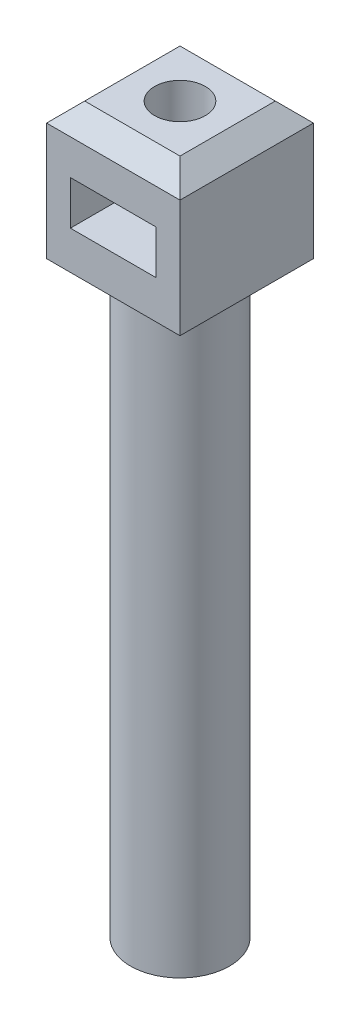
ISO-10303-21;
HEADER;
FILE_DESCRIPTION(('STEP AP214'),'2;1');
FILE_NAME('part.step','',(''),(''),'','','');
FILE_SCHEMA(('AUTOMOTIVE_DESIGN { 1 0 10303 214 1 1 1 1 }'));
ENDSEC;
DATA;
#1=APPLICATION_CONTEXT('core data for automotive mechanical design processes');
#2=APPLICATION_PROTOCOL_DEFINITION('international standard','automotive_design',2000,#1);
#3=PRODUCT_CONTEXT('',#1,'mechanical');
#4=PRODUCT('Part','Part','',(#3));
#5=PRODUCT_RELATED_PRODUCT_CATEGORY('part','',(#4));
#6=PRODUCT_DEFINITION_FORMATION('','',#4);
#7=PRODUCT_DEFINITION_CONTEXT('part definition',#1,'design');
#8=PRODUCT_DEFINITION('design','',#6,#7);
#9=PRODUCT_DEFINITION_SHAPE('','',#8);
#10=(LENGTH_UNIT() NAMED_UNIT(*) SI_UNIT(.MILLI.,.METRE.));
#11=(NAMED_UNIT(*) PLANE_ANGLE_UNIT() SI_UNIT($,.RADIAN.));
#12=(NAMED_UNIT(*) SI_UNIT($,.STERADIAN.) SOLID_ANGLE_UNIT());
#13=UNCERTAINTY_MEASURE_WITH_UNIT(LENGTH_MEASURE(1.E-05),#10,'distance_accuracy_value','');
#14=(GEOMETRIC_REPRESENTATION_CONTEXT(3) GLOBAL_UNCERTAINTY_ASSIGNED_CONTEXT((#13)) GLOBAL_UNIT_ASSIGNED_CONTEXT((#10,
#11,#12)) REPRESENTATION_CONTEXT('',''));
#15=CARTESIAN_POINT('',(0.,0.,0.));
#16=DIRECTION('',(0.,0.,1.));
#17=DIRECTION('',(1.,0.,0.));
#18=AXIS2_PLACEMENT_3D('',#15,#16,#17);
#19=CARTESIAN_POINT('',(0.,50.8,0.));
#20=DIRECTION('',(0.,-1.,0.));
#21=DIRECTION('',(0.,0.,-1.));
#22=AXIS2_PLACEMENT_3D('',#19,#20,#21);
#23=PLANE('',#22);
#24=DIRECTION('',(0.,0.,-1.));
#25=VECTOR('',#24,1.);
#26=CARTESIAN_POINT('',(-6.34999999999998,50.8,-8.89));
#27=LINE('',#26,#25);
#28=CARTESIAN_POINT('',(-6.34999999999998,50.8,-1.81392282084995));
#29=VERTEX_POINT('',#28);
#30=CARTESIAN_POINT('',(-6.34999999999998,50.8,-6.34999999999998));
#31=VERTEX_POINT('',#30);
#32=EDGE_CURVE('E194',#29,#31,#27,.T.);
#33=ORIENTED_EDGE('',*,*,#32,.T.);
#34=DIRECTION('',(1.,0.,0.));
#35=VECTOR('',#34,1.);
#36=CARTESIAN_POINT('',(8.89,50.8,-6.34999999999998));
#37=LINE('',#36,#35);
#38=CARTESIAN_POINT('',(-1.81392282084994,50.8,-6.34999999999998));
#39=VERTEX_POINT('',#38);
#40=EDGE_CURVE('E196',#31,#39,#37,.T.);
#41=ORIENTED_EDGE('',*,*,#40,.T.);
#42=CARTESIAN_POINT('',(0.,50.8,0.));
#43=DIRECTION('',(0.,-1.,0.));
#44=DIRECTION('',(0.,0.,-1.));
#45=AXIS2_PLACEMENT_3D('',#42,#43,#44);
#46=CIRCLE('',#45,6.604);
#47=EDGE_CURVE('E287',#29,#39,#46,.T.);
#48=ORIENTED_EDGE('',*,*,#47,.F.);
#49=EDGE_LOOP('',(#33,#41,#48));
#50=FACE_BOUND('',#49,.T.);
#51=ADVANCED_FACE('F35',(#50),#23,.T.);
#52=CARTESIAN_POINT('',(1.81392282084994,50.8,-6.34999999999998));
#53=VERTEX_POINT('',#52);
#54=CARTESIAN_POINT('',(6.34999999999999,50.8,-1.81392282084993));
#55=VERTEX_POINT('',#54);
#56=EDGE_CURVE('E159',#53,#55,#46,.T.);
#57=ORIENTED_EDGE('',*,*,#56,.F.);
#58=DIRECTION('',(1.,0.,0.));
#59=VECTOR('',#58,1.);
#60=CARTESIAN_POINT('',(8.89,50.8,-6.34999999999998));
#61=LINE('',#60,#59);
#62=CARTESIAN_POINT('',(6.34999999999999,50.8,-6.34999999999998));
#63=VERTEX_POINT('',#62);
#64=EDGE_CURVE('E192',#53,#63,#61,.T.);
#65=ORIENTED_EDGE('',*,*,#64,.T.);
#66=DIRECTION('',(0.,0.,1.));
#67=VECTOR('',#66,1.);
#68=CARTESIAN_POINT('',(6.34999999999999,50.8,8.89));
#69=LINE('',#68,#67);
#70=EDGE_CURVE('E190',#63,#55,#69,.T.);
#71=ORIENTED_EDGE('',*,*,#70,.T.);
#72=EDGE_LOOP('',(#57,#65,#71));
#73=FACE_BOUND('',#72,.T.);
#74=ADVANCED_FACE('F318',(#73),#23,.T.);
#75=CARTESIAN_POINT('',(6.34999999999999,50.8,1.81392282084993));
#76=VERTEX_POINT('',#75);
#77=CARTESIAN_POINT('',(1.81392282084994,50.8,6.34999999999998));
#78=VERTEX_POINT('',#77);
#79=EDGE_CURVE('E289',#76,#78,#46,.T.);
#80=ORIENTED_EDGE('',*,*,#79,.F.);
#81=DIRECTION('',(0.,0.,1.));
#82=VECTOR('',#81,1.);
#83=CARTESIAN_POINT('',(6.34999999999999,50.8,8.89));
#84=LINE('',#83,#82);
#85=CARTESIAN_POINT('',(6.34999999999999,50.8,6.34999999999998));
#86=VERTEX_POINT('',#85);
#87=EDGE_CURVE('E188',#76,#86,#84,.T.);
#88=ORIENTED_EDGE('',*,*,#87,.T.);
#89=DIRECTION('',(-1.,0.,0.));
#90=VECTOR('',#89,1.);
#91=CARTESIAN_POINT('',(-8.89,50.8,6.34999999999998));
#92=LINE('',#91,#90);
#93=EDGE_CURVE('E186',#86,#78,#92,.T.);
#94=ORIENTED_EDGE('',*,*,#93,.T.);
#95=EDGE_LOOP('',(#80,#88,#94));
#96=FACE_BOUND('',#95,.T.);
#97=ADVANCED_FACE('F339',(#96),#23,.T.);
#98=CARTESIAN_POINT('',(0.,63.5,0.));
#99=DIRECTION('',(0.,-1.,0.));
#100=DIRECTION('',(0.,0.,-1.));
#101=AXIS2_PLACEMENT_3D('',#98,#99,#100);
#102=CYLINDRICAL_SURFACE('',#101,6.604);
#103=ORIENTED_EDGE('',*,*,#56,.T.);
#104=CARTESIAN_POINT('',(0.,45.4717173420242,0.));
#105=DIRECTION('',(0.642787609686544,-0.766044443118974,0.));
#106=DIRECTION('',(-0.766044443118974,-0.642787609686544,0.));
#107=AXIS2_PLACEMENT_3D('',#104,#105,#106);
#108=ELLIPSE('',#107,8.62090973875041,6.604);
#109=EDGE_CURVE('E212',#55,#76,#108,.T.);
#110=ORIENTED_EDGE('',*,*,#109,.T.);
#111=ORIENTED_EDGE('',*,*,#79,.T.);
#112=CARTESIAN_POINT('',(0.,45.4717173420242,0.));
#113=DIRECTION('',(0.,-0.766044443118974,0.642787609686544));
#114=DIRECTION('',(0.,-0.642787609686544,-0.766044443118974));
#115=AXIS2_PLACEMENT_3D('',#112,#113,#114);
#116=ELLIPSE('',#115,8.62090973875041,6.604);
#117=CARTESIAN_POINT('',(-1.81392282084994,50.8,6.34999999999998));
#118=VERTEX_POINT('',#117);
#119=EDGE_CURVE('E214',#78,#118,#116,.T.);
#120=ORIENTED_EDGE('',*,*,#119,.T.);
#121=CARTESIAN_POINT('',(-6.34999999999998,50.8,1.81392282084995));
#122=VERTEX_POINT('',#121);
#123=EDGE_CURVE('E294',#118,#122,#46,.T.);
#124=ORIENTED_EDGE('',*,*,#123,.T.);
#125=CARTESIAN_POINT('',(0.,45.4717173420242,0.));
#126=DIRECTION('',(-0.642787609686544,-0.766044443118974,0.));
#127=DIRECTION('',(0.766044443118974,-0.642787609686544,0.));
#128=AXIS2_PLACEMENT_3D('',#125,#126,#127);
#129=ELLIPSE('',#128,8.62090973875041,6.604);
#130=EDGE_CURVE('E210',#122,#29,#129,.T.);
#131=ORIENTED_EDGE('',*,*,#130,.T.);
#132=ORIENTED_EDGE('',*,*,#47,.T.);
#133=CARTESIAN_POINT('',(0.,45.4717173420242,0.));
#134=DIRECTION('',(0.,-0.766044443118974,-0.642787609686544));
#135=DIRECTION('',(0.,-0.642787609686544,0.766044443118974));
#136=AXIS2_PLACEMENT_3D('',#133,#134,#135);
#137=ELLIPSE('',#136,8.62090973875041,6.604);
#138=EDGE_CURVE('E208',#39,#53,#137,.T.);
#139=ORIENTED_EDGE('',*,*,#138,.T.);
#140=EDGE_LOOP('',(#103,#110,#111,#120,#124,#131,#132,#139));
#141=FACE_BOUND('',#140,.T.);
#142=CARTESIAN_POINT('',(0.,-25.4,0.));
#143=DIRECTION('',(0.,-1.,0.));
#144=DIRECTION('',(0.,0.,-1.));
#145=AXIS2_PLACEMENT_3D('',#142,#143,#144);
#146=CIRCLE('',#145,6.604);
#147=CARTESIAN_POINT('',(0.,-25.4,-6.604));
#148=VERTEX_POINT('',#147);
#149=EDGE_CURVE('E249',#148,#148,#146,.T.);
#150=ORIENTED_EDGE('',*,*,#149,.F.);
#151=EDGE_LOOP('',(#150));
#152=FACE_BOUND('',#151,.T.);
#153=ADVANCED_FACE('F300',(#141,#152),#102,.T.);
#154=DIRECTION('',(-1.,0.,0.));
#155=VECTOR('',#154,1.);
#156=CARTESIAN_POINT('',(-8.89,50.8,6.34999999999998));
#157=LINE('',#156,#155);
#158=CARTESIAN_POINT('',(-6.34999999999998,50.8,6.34999999999998));
#159=VERTEX_POINT('',#158);
#160=EDGE_CURVE('E182',#118,#159,#157,.T.);
#161=ORIENTED_EDGE('',*,*,#160,.T.);
#162=DIRECTION('',(0.,0.,-1.));
#163=VECTOR('',#162,1.);
#164=CARTESIAN_POINT('',(-6.34999999999998,50.8,-8.89));
#165=LINE('',#164,#163);
#166=EDGE_CURVE('E184',#159,#122,#165,.T.);
#167=ORIENTED_EDGE('',*,*,#166,.T.);
#168=ORIENTED_EDGE('',*,*,#123,.F.);
#169=EDGE_LOOP('',(#161,#167,#168));
#170=FACE_BOUND('',#169,.T.);
#171=ADVANCED_FACE('F342',(#170),#23,.T.);
#172=CARTESIAN_POINT('',(8.89,71.12,8.89));
#173=DIRECTION('',(-1.,0.,0.));
#174=DIRECTION('',(0.,0.,1.));
#175=AXIS2_PLACEMENT_3D('',#172,#173,#174);
#176=PLANE('',#175);
#177=DIRECTION('',(0.,-1.,0.));
#178=VECTOR('',#177,1.);
#179=CARTESIAN_POINT('',(8.89,71.12,-8.89));
#180=LINE('',#179,#178);
#181=CARTESIAN_POINT('',(8.89,68.58,-8.89));
#182=VERTEX_POINT('',#181);
#183=CARTESIAN_POINT('',(8.89,52.9313130631903,-8.89));
#184=VERTEX_POINT('',#183);
#185=EDGE_CURVE('E286',#182,#184,#180,.T.);
#186=ORIENTED_EDGE('',*,*,#185,.F.);
#187=DIRECTION('',(0.,0.,1.));
#188=VECTOR('',#187,1.);
#189=CARTESIAN_POINT('',(8.89,68.58,8.89));
#190=LINE('',#189,#188);
#191=CARTESIAN_POINT('',(8.89,68.58,8.89));
#192=VERTEX_POINT('',#191);
#193=EDGE_CURVE('E232',#182,#192,#190,.T.);
#194=ORIENTED_EDGE('',*,*,#193,.T.);
#195=DIRECTION('',(0.,-1.,0.));
#196=VECTOR('',#195,1.);
#197=CARTESIAN_POINT('',(8.89,71.12,8.89));
#198=LINE('',#197,#196);
#199=CARTESIAN_POINT('',(8.89,52.9313130631903,8.89));
#200=VERTEX_POINT('',#199);
#201=EDGE_CURVE('E280',#192,#200,#198,.T.);
#202=ORIENTED_EDGE('',*,*,#201,.T.);
#203=DIRECTION('',(0.,0.,-1.));
#204=VECTOR('',#203,1.);
#205=CARTESIAN_POINT('',(8.89,52.9313130631903,-8.89));
#206=LINE('',#205,#204);
#207=EDGE_CURVE('E202',#200,#184,#206,.T.);
#208=ORIENTED_EDGE('',*,*,#207,.T.);
#209=EDGE_LOOP('',(#186,#194,#202,#208));
#210=FACE_BOUND('',#209,.T.);
#211=ADVANCED_FACE('F330',(#210),#176,.F.);
#212=CARTESIAN_POINT('',(-8.89,71.12,-8.89));
#213=DIRECTION('',(0.,0.,1.));
#214=DIRECTION('',(1.,0.,0.));
#215=AXIS2_PLACEMENT_3D('',#212,#213,#214);
#216=PLANE('',#215);
#217=DIRECTION('',(1.,0.,0.));
#218=VECTOR('',#217,1.);
#219=CARTESIAN_POINT('',(-8.89,58.039,-8.89));
#220=LINE('',#219,#218);
#221=CARTESIAN_POINT('',(-5.71500000000003,58.039,-8.89));
#222=VERTEX_POINT('',#221);
#223=CARTESIAN_POINT('',(5.71499999999997,58.039,-8.89));
#224=VERTEX_POINT('',#223);
#225=EDGE_CURVE('E274',#222,#224,#220,.T.);
#226=ORIENTED_EDGE('',*,*,#225,.T.);
#227=DIRECTION('',(0.,1.,0.));
#228=VECTOR('',#227,1.);
#229=CARTESIAN_POINT('',(5.71499999999997,71.12,-8.89));
#230=LINE('',#229,#228);
#231=CARTESIAN_POINT('',(5.71499999999997,63.881,-8.89));
#232=VERTEX_POINT('',#231);
#233=EDGE_CURVE('E277',#224,#232,#230,.T.);
#234=ORIENTED_EDGE('',*,*,#233,.T.);
#235=DIRECTION('',(-1.,0.,0.));
#236=VECTOR('',#235,1.);
#237=CARTESIAN_POINT('',(-8.89,63.881,-8.89));
#238=LINE('',#237,#236);
#239=CARTESIAN_POINT('',(-5.71500000000003,63.881,-8.89));
#240=VERTEX_POINT('',#239);
#241=EDGE_CURVE('E269',#232,#240,#238,.T.);
#242=ORIENTED_EDGE('',*,*,#241,.T.);
#243=DIRECTION('',(0.,-1.,0.));
#244=VECTOR('',#243,1.);
#245=CARTESIAN_POINT('',(-5.71500000000003,71.12,-8.89));
#246=LINE('',#245,#244);
#247=EDGE_CURVE('E166',#240,#222,#246,.T.);
#248=ORIENTED_EDGE('',*,*,#247,.T.);
#249=EDGE_LOOP('',(#226,#234,#242,#248));
#250=FACE_BOUND('',#249,.T.);
#251=DIRECTION('',(0.,-1.,0.));
#252=VECTOR('',#251,1.);
#253=CARTESIAN_POINT('',(-8.89,71.12,-8.89));
#254=LINE('',#253,#252);
#255=CARTESIAN_POINT('',(-8.89,68.58,-8.89));
#256=VERTEX_POINT('',#255);
#257=CARTESIAN_POINT('',(-8.89,52.9313130631903,-8.89));
#258=VERTEX_POINT('',#257);
#259=EDGE_CURVE('E284',#256,#258,#254,.T.);
#260=ORIENTED_EDGE('',*,*,#259,.F.);
#261=DIRECTION('',(1.,0.,0.));
#262=VECTOR('',#261,1.);
#263=CARTESIAN_POINT('',(-8.89,68.58,-8.89));
#264=LINE('',#263,#262);
#265=EDGE_CURVE('E242',#256,#182,#264,.T.);
#266=ORIENTED_EDGE('',*,*,#265,.T.);
#267=ORIENTED_EDGE('',*,*,#185,.T.);
#268=DIRECTION('',(-1.,0.,0.));
#269=VECTOR('',#268,1.);
#270=CARTESIAN_POINT('',(-8.89,52.9313130631903,-8.89));
#271=LINE('',#270,#269);
#272=EDGE_CURVE('E179',#184,#258,#271,.T.);
#273=ORIENTED_EDGE('',*,*,#272,.T.);
#274=EDGE_LOOP('',(#260,#266,#267,#273));
#275=FACE_BOUND('',#274,.T.);
#276=ADVANCED_FACE('F326',(#250,#275),#216,.F.);
#277=CARTESIAN_POINT('',(-8.89,71.12,8.89));
#278=DIRECTION('',(1.,0.,0.));
#279=DIRECTION('',(0.,0.,-1.));
#280=AXIS2_PLACEMENT_3D('',#277,#278,#279);
#281=PLANE('',#280);
#282=DIRECTION('',(0.,-1.,0.));
#283=VECTOR('',#282,1.);
#284=CARTESIAN_POINT('',(-8.89,71.12,8.89));
#285=LINE('',#284,#283);
#286=CARTESIAN_POINT('',(-8.89,68.58,8.89));
#287=VERTEX_POINT('',#286);
#288=CARTESIAN_POINT('',(-8.89,52.9313130631903,8.89));
#289=VERTEX_POINT('',#288);
#290=EDGE_CURVE('E282',#287,#289,#285,.T.);
#291=ORIENTED_EDGE('',*,*,#290,.F.);
#292=DIRECTION('',(0.,0.,-1.));
#293=VECTOR('',#292,1.);
#294=CARTESIAN_POINT('',(-8.89,68.58,8.89));
#295=LINE('',#294,#293);
#296=EDGE_CURVE('E44',#287,#256,#295,.T.);
#297=ORIENTED_EDGE('',*,*,#296,.T.);
#298=ORIENTED_EDGE('',*,*,#259,.T.);
#299=DIRECTION('',(0.,0.,1.));
#300=VECTOR('',#299,1.);
#301=CARTESIAN_POINT('',(-8.89,52.9313130631903,8.89));
#302=LINE('',#301,#300);
#303=EDGE_CURVE('E199',#258,#289,#302,.T.);
#304=ORIENTED_EDGE('',*,*,#303,.T.);
#305=EDGE_LOOP('',(#291,#297,#298,#304));
#306=FACE_BOUND('',#305,.T.);
#307=ADVANCED_FACE('F443',(#306),#281,.F.);
#308=CARTESIAN_POINT('',(-8.89,71.12,8.89));
#309=DIRECTION('',(0.,0.,-1.));
#310=DIRECTION('',(-1.,0.,0.));
#311=AXIS2_PLACEMENT_3D('',#308,#309,#310);
#312=PLANE('',#311);
#313=DIRECTION('',(1.,0.,0.));
#314=VECTOR('',#313,1.);
#315=CARTESIAN_POINT('',(-8.89,63.881,8.89));
#316=LINE('',#315,#314);
#317=CARTESIAN_POINT('',(-5.71500000000003,63.881,8.89));
#318=VERTEX_POINT('',#317);
#319=CARTESIAN_POINT('',(5.71499999999997,63.881,8.89));
#320=VERTEX_POINT('',#319);
#321=EDGE_CURVE('E147',#318,#320,#316,.T.);
#322=ORIENTED_EDGE('',*,*,#321,.T.);
#323=DIRECTION('',(0.,-1.,0.));
#324=VECTOR('',#323,1.);
#325=CARTESIAN_POINT('',(5.71499999999997,71.12,8.89));
#326=LINE('',#325,#324);
#327=CARTESIAN_POINT('',(5.71499999999997,58.039,8.89));
#328=VERTEX_POINT('',#327);
#329=EDGE_CURVE('E174',#320,#328,#326,.T.);
#330=ORIENTED_EDGE('',*,*,#329,.T.);
#331=DIRECTION('',(-1.,0.,0.));
#332=VECTOR('',#331,1.);
#333=CARTESIAN_POINT('',(-8.89,58.039,8.89));
#334=LINE('',#333,#332);
#335=CARTESIAN_POINT('',(-5.71500000000003,58.039,8.89));
#336=VERTEX_POINT('',#335);
#337=EDGE_CURVE('E172',#328,#336,#334,.T.);
#338=ORIENTED_EDGE('',*,*,#337,.T.);
#339=DIRECTION('',(0.,1.,0.));
#340=VECTOR('',#339,1.);
#341=CARTESIAN_POINT('',(-5.71500000000003,71.12,8.89));
#342=LINE('',#341,#340);
#343=EDGE_CURVE('E158',#336,#318,#342,.T.);
#344=ORIENTED_EDGE('',*,*,#343,.T.);
#345=EDGE_LOOP('',(#322,#330,#338,#344));
#346=FACE_BOUND('',#345,.T.);
#347=ORIENTED_EDGE('',*,*,#201,.F.);
#348=DIRECTION('',(-1.,0.,0.));
#349=VECTOR('',#348,1.);
#350=CARTESIAN_POINT('',(-8.89,68.58,8.89));
#351=LINE('',#350,#349);
#352=EDGE_CURVE('E11',#192,#287,#351,.T.);
#353=ORIENTED_EDGE('',*,*,#352,.T.);
#354=ORIENTED_EDGE('',*,*,#290,.T.);
#355=DIRECTION('',(1.,0.,0.));
#356=VECTOR('',#355,1.);
#357=CARTESIAN_POINT('',(8.89,52.9313130631903,8.89));
#358=LINE('',#357,#356);
#359=EDGE_CURVE('E205',#289,#200,#358,.T.);
#360=ORIENTED_EDGE('',*,*,#359,.T.);
#361=EDGE_LOOP('',(#347,#353,#354,#360));
#362=FACE_BOUND('',#361,.T.);
#363=ADVANCED_FACE('F171',(#346,#362),#312,.F.);
#364=CARTESIAN_POINT('',(0.,71.12,0.));
#365=DIRECTION('',(0.,-1.,0.));
#366=DIRECTION('',(0.,0.,-1.));
#367=AXIS2_PLACEMENT_3D('',#364,#365,#366);
#368=PLANE('',#367);
#369=CARTESIAN_POINT('',(0.,71.12,0.));
#370=DIRECTION('',(0.,1.,0.));
#371=DIRECTION('',(0.,0.,1.));
#372=AXIS2_PLACEMENT_3D('',#369,#370,#371);
#373=CIRCLE('',#372,3.37819999999999);
#374=CARTESIAN_POINT('',(0.,71.12,3.37819999999999));
#375=VERTEX_POINT('',#374);
#376=EDGE_CURVE('E256',#375,#375,#373,.T.);
#377=ORIENTED_EDGE('',*,*,#376,.F.);
#378=EDGE_LOOP('',(#377));
#379=FACE_BOUND('',#378,.T.);
#380=DIRECTION('',(0.,0.,-1.));
#381=VECTOR('',#380,1.);
#382=CARTESIAN_POINT('',(6.35,71.12,0.));
#383=LINE('',#382,#381);
#384=CARTESIAN_POINT('',(6.35,71.12,6.35));
#385=VERTEX_POINT('',#384);
#386=CARTESIAN_POINT('',(6.35,71.12,-6.35));
#387=VERTEX_POINT('',#386);
#388=EDGE_CURVE('E216',#385,#387,#383,.T.);
#389=ORIENTED_EDGE('',*,*,#388,.T.);
#390=DIRECTION('',(-1.,0.,0.));
#391=VECTOR('',#390,1.);
#392=CARTESIAN_POINT('',(0.,71.12,-6.35));
#393=LINE('',#392,#391);
#394=CARTESIAN_POINT('',(-6.35,71.12,-6.35));
#395=VERTEX_POINT('',#394);
#396=EDGE_CURVE('E239',#387,#395,#393,.T.);
#397=ORIENTED_EDGE('',*,*,#396,.T.);
#398=DIRECTION('',(0.,0.,1.));
#399=VECTOR('',#398,1.);
#400=CARTESIAN_POINT('',(-6.35,71.12,0.));
#401=LINE('',#400,#399);
#402=CARTESIAN_POINT('',(-6.35,71.12,6.35));
#403=VERTEX_POINT('',#402);
#404=EDGE_CURVE('E237',#395,#403,#401,.T.);
#405=ORIENTED_EDGE('',*,*,#404,.T.);
#406=DIRECTION('',(1.,0.,0.));
#407=VECTOR('',#406,1.);
#408=CARTESIAN_POINT('',(0.,71.12,6.35));
#409=LINE('',#408,#407);
#410=EDGE_CURVE('E235',#403,#385,#409,.T.);
#411=ORIENTED_EDGE('',*,*,#410,.T.);
#412=EDGE_LOOP('',(#389,#397,#405,#411));
#413=FACE_BOUND('',#412,.T.);
#414=ADVANCED_FACE('F461',(#379,#413),#368,.F.);
#415=CARTESIAN_POINT('',(5.71499999999997,58.039,-12.7));
#416=DIRECTION('',(1.,0.,0.));
#417=DIRECTION('',(0.,0.,-1.));
#418=AXIS2_PLACEMENT_3D('',#415,#416,#417);
#419=PLANE('',#418);
#420=DIRECTION('',(0.,0.,1.));
#421=VECTOR('',#420,1.);
#422=CARTESIAN_POINT('',(5.71499999999997,58.039,-12.7));
#423=LINE('',#422,#421);
#424=EDGE_CURVE('E266',#224,#328,#423,.T.);
#425=ORIENTED_EDGE('',*,*,#424,.T.);
#426=ORIENTED_EDGE('',*,*,#329,.F.);
#427=DIRECTION('',(0.,0.,1.));
#428=VECTOR('',#427,1.);
#429=CARTESIAN_POINT('',(5.71499999999997,63.881,-12.7));
#430=LINE('',#429,#428);
#431=EDGE_CURVE('E153',#232,#320,#430,.T.);
#432=ORIENTED_EDGE('',*,*,#431,.F.);
#433=ORIENTED_EDGE('',*,*,#233,.F.);
#434=EDGE_LOOP('',(#425,#426,#432,#433));
#435=FACE_BOUND('',#434,.T.);
#436=ADVANCED_FACE('F469',(#435),#419,.F.);
#437=CARTESIAN_POINT('',(-5.71500000000003,58.039,-12.7));
#438=DIRECTION('',(0.,-1.,0.));
#439=DIRECTION('',(0.,0.,-1.));
#440=AXIS2_PLACEMENT_3D('',#437,#438,#439);
#441=PLANE('',#440);
#442=DIRECTION('',(0.,0.,1.));
#443=VECTOR('',#442,1.);
#444=CARTESIAN_POINT('',(-5.71500000000003,58.039,-12.7));
#445=LINE('',#444,#443);
#446=EDGE_CURVE('E168',#222,#336,#445,.T.);
#447=ORIENTED_EDGE('',*,*,#446,.T.);
#448=ORIENTED_EDGE('',*,*,#337,.F.);
#449=ORIENTED_EDGE('',*,*,#424,.F.);
#450=ORIENTED_EDGE('',*,*,#225,.F.);
#451=EDGE_LOOP('',(#447,#448,#449,#450));
#452=FACE_BOUND('',#451,.T.);
#453=ADVANCED_FACE('F524',(#452),#441,.F.);
#454=CARTESIAN_POINT('',(-5.71500000000003,58.039,-12.7));
#455=DIRECTION('',(-1.,0.,0.));
#456=DIRECTION('',(0.,0.,1.));
#457=AXIS2_PLACEMENT_3D('',#454,#455,#456);
#458=PLANE('',#457);
#459=DIRECTION('',(0.,0.,1.));
#460=VECTOR('',#459,1.);
#461=CARTESIAN_POINT('',(-5.71500000000003,63.881,-12.7));
#462=LINE('',#461,#460);
#463=EDGE_CURVE('E150',#240,#318,#462,.T.);
#464=ORIENTED_EDGE('',*,*,#463,.T.);
#465=ORIENTED_EDGE('',*,*,#343,.F.);
#466=ORIENTED_EDGE('',*,*,#446,.F.);
#467=ORIENTED_EDGE('',*,*,#247,.F.);
#468=EDGE_LOOP('',(#464,#465,#466,#467));
#469=FACE_BOUND('',#468,.T.);
#470=ADVANCED_FACE('F162',(#469),#458,.F.);
#471=CARTESIAN_POINT('',(-5.71500000000003,63.881,-12.7));
#472=DIRECTION('',(0.,1.,0.));
#473=DIRECTION('',(0.,0.,1.));
#474=AXIS2_PLACEMENT_3D('',#471,#472,#473);
#475=PLANE('',#474);
#476=CARTESIAN_POINT('',(0.,63.881,0.));
#477=DIRECTION('',(0.,1.,0.));
#478=DIRECTION('',(0.,0.,1.));
#479=AXIS2_PLACEMENT_3D('',#476,#477,#478);
#480=CIRCLE('',#479,3.3782);
#481=CARTESIAN_POINT('',(0.,63.881,3.3782));
#482=VERTEX_POINT('',#481);
#483=EDGE_CURVE('E221',#482,#482,#480,.T.);
#484=ORIENTED_EDGE('',*,*,#483,.T.);
#485=EDGE_LOOP('',(#484));
#486=FACE_BOUND('',#485,.T.);
#487=ORIENTED_EDGE('',*,*,#431,.T.);
#488=ORIENTED_EDGE('',*,*,#321,.F.);
#489=ORIENTED_EDGE('',*,*,#463,.F.);
#490=ORIENTED_EDGE('',*,*,#241,.F.);
#491=EDGE_LOOP('',(#487,#488,#489,#490));
#492=FACE_BOUND('',#491,.T.);
#493=ADVANCED_FACE('F149',(#486,#492),#475,.F.);
#494=CARTESIAN_POINT('',(-8.89,52.9313130631903,8.89));
#495=DIRECTION('',(0.,-0.766044443118974,0.642787609686544));
#496=DIRECTION('',(-1.,0.,0.));
#497=AXIS2_PLACEMENT_3D('',#494,#495,#496);
#498=PLANE('',#497);
#499=ORIENTED_EDGE('',*,*,#119,.F.);
#500=ORIENTED_EDGE('',*,*,#93,.F.);
#501=DIRECTION('',(0.608120402411341,0.510273605374742,0.608120402411341));
#502=VECTOR('',#501,1.);
#503=CARTESIAN_POINT('',(2.31477066432161,47.4140405527165,2.3147706643216));
#504=LINE('',#503,#502);
#505=EDGE_CURVE('E227',#200,#86,#504,.F.);
#506=ORIENTED_EDGE('',*,*,#505,.F.);
#507=ORIENTED_EDGE('',*,*,#359,.F.);
#508=DIRECTION('',(0.608120402411341,-0.510273605374742,-0.608120402411341));
#509=VECTOR('',#508,1.);
#510=CARTESIAN_POINT('',(-8.89,52.9313130631903,8.89));
#511=LINE('',#510,#509);
#512=EDGE_CURVE('E224',#159,#289,#511,.F.);
#513=ORIENTED_EDGE('',*,*,#512,.F.);
#514=ORIENTED_EDGE('',*,*,#160,.F.);
#515=EDGE_LOOP('',(#499,#500,#506,#507,#513,#514));
#516=FACE_BOUND('',#515,.T.);
#517=ADVANCED_FACE('F335',(#516),#498,.T.);
#518=CARTESIAN_POINT('',(8.89,52.9313130631903,8.89));
#519=DIRECTION('',(0.642787609686544,-0.766044443118974,0.));
#520=DIRECTION('',(0.,0.,1.));
#521=AXIS2_PLACEMENT_3D('',#518,#519,#520);
#522=PLANE('',#521);
#523=ORIENTED_EDGE('',*,*,#109,.F.);
#524=ORIENTED_EDGE('',*,*,#70,.F.);
#525=DIRECTION('',(0.608120402411341,0.510273605374742,-0.608120402411341));
#526=VECTOR('',#525,1.);
#527=CARTESIAN_POINT('',(2.3147706643216,47.4140405527165,-2.3147706643216));
#528=LINE('',#527,#526);
#529=EDGE_CURVE('E220',#184,#63,#528,.F.);
#530=ORIENTED_EDGE('',*,*,#529,.F.);
#531=ORIENTED_EDGE('',*,*,#207,.F.);
#532=ORIENTED_EDGE('',*,*,#505,.T.);
#533=ORIENTED_EDGE('',*,*,#87,.F.);
#534=EDGE_LOOP('',(#523,#524,#530,#531,#532,#533));
#535=FACE_BOUND('',#534,.T.);
#536=ADVANCED_FACE('F322',(#535),#522,.T.);
#537=CARTESIAN_POINT('',(-8.89,52.9313130631903,8.89));
#538=DIRECTION('',(-0.642787609686544,-0.766044443118974,0.));
#539=DIRECTION('',(0.,0.,-1.));
#540=AXIS2_PLACEMENT_3D('',#537,#538,#539);
#541=PLANE('',#540);
#542=ORIENTED_EDGE('',*,*,#512,.T.);
#543=ORIENTED_EDGE('',*,*,#303,.F.);
#544=DIRECTION('',(0.608120402411341,-0.510273605374742,0.608120402411341));
#545=VECTOR('',#544,1.);
#546=CARTESIAN_POINT('',(-2.3147706643216,47.4140405527165,-2.3147706643216));
#547=LINE('',#546,#545);
#548=EDGE_CURVE('E217',#31,#258,#547,.F.);
#549=ORIENTED_EDGE('',*,*,#548,.F.);
#550=ORIENTED_EDGE('',*,*,#32,.F.);
#551=ORIENTED_EDGE('',*,*,#130,.F.);
#552=ORIENTED_EDGE('',*,*,#166,.F.);
#553=EDGE_LOOP('',(#542,#543,#549,#550,#551,#552));
#554=FACE_BOUND('',#553,.T.);
#555=ADVANCED_FACE('F308',(#554),#541,.T.);
#556=CARTESIAN_POINT('',(-8.89,52.9313130631903,-8.89));
#557=DIRECTION('',(0.,-0.766044443118974,-0.642787609686544));
#558=DIRECTION('',(1.,0.,0.));
#559=AXIS2_PLACEMENT_3D('',#556,#557,#558);
#560=PLANE('',#559);
#561=ORIENTED_EDGE('',*,*,#138,.F.);
#562=ORIENTED_EDGE('',*,*,#40,.F.);
#563=ORIENTED_EDGE('',*,*,#548,.T.);
#564=ORIENTED_EDGE('',*,*,#272,.F.);
#565=ORIENTED_EDGE('',*,*,#529,.T.);
#566=ORIENTED_EDGE('',*,*,#64,.F.);
#567=EDGE_LOOP('',(#561,#562,#563,#564,#565,#566));
#568=FACE_BOUND('',#567,.T.);
#569=ADVANCED_FACE('F314',(#568),#560,.T.);
#570=CARTESIAN_POINT('',(0.,71.12,0.));
#571=DIRECTION('',(0.,1.,0.));
#572=DIRECTION('',(0.,0.,1.));
#573=AXIS2_PLACEMENT_3D('',#570,#571,#572);
#574=CYLINDRICAL_SURFACE('',#573,3.3782);
#575=ORIENTED_EDGE('',*,*,#483,.F.);
#576=EDGE_LOOP('',(#575));
#577=FACE_BOUND('',#576,.T.);
#578=ORIENTED_EDGE('',*,*,#376,.T.);
#579=EDGE_LOOP('',(#578));
#580=FACE_BOUND('',#579,.T.);
#581=ADVANCED_FACE('F407',(#577,#580),#574,.F.);
#582=CARTESIAN_POINT('',(6.35,71.12,0.));
#583=DIRECTION('',(-0.70710678118655,-0.707106781186546,0.));
#584=DIRECTION('',(0.,0.,-1.));
#585=AXIS2_PLACEMENT_3D('',#582,#583,#584);
#586=PLANE('',#585);
#587=ORIENTED_EDGE('',*,*,#193,.F.);
#588=DIRECTION('',(-0.577350269189625,0.577350269189628,0.577350269189625));
#589=VECTOR('',#588,1.);
#590=CARTESIAN_POINT('',(4.23333333333334,73.2366666666667,-4.23333333333334));
#591=LINE('',#590,#589);
#592=EDGE_CURVE('E246',#182,#387,#591,.T.);
#593=ORIENTED_EDGE('',*,*,#592,.T.);
#594=ORIENTED_EDGE('',*,*,#388,.F.);
#595=DIRECTION('',(0.577350269189625,-0.577350269189628,0.577350269189625));
#596=VECTOR('',#595,1.);
#597=CARTESIAN_POINT('',(4.23333333333334,73.2366666666667,4.23333333333334));
#598=LINE('',#597,#596);
#599=EDGE_CURVE('E244',#385,#192,#598,.T.);
#600=ORIENTED_EDGE('',*,*,#599,.T.);
#601=EDGE_LOOP('',(#587,#593,#594,#600));
#602=FACE_BOUND('',#601,.T.);
#603=ADVANCED_FACE('F425',(#602),#586,.F.);
#604=CARTESIAN_POINT('',(0.,71.12,6.35));
#605=DIRECTION('',(0.,-0.707106781186546,-0.70710678118655));
#606=DIRECTION('',(1.,0.,0.));
#607=AXIS2_PLACEMENT_3D('',#604,#605,#606);
#608=PLANE('',#607);
#609=ORIENTED_EDGE('',*,*,#599,.F.);
#610=ORIENTED_EDGE('',*,*,#410,.F.);
#611=DIRECTION('',(-0.577350269189625,-0.577350269189628,0.577350269189625));
#612=VECTOR('',#611,1.);
#613=CARTESIAN_POINT('',(-4.23333333333334,73.2366666666667,4.23333333333334));
#614=LINE('',#613,#612);
#615=EDGE_CURVE('E39',#287,#403,#614,.F.);
#616=ORIENTED_EDGE('',*,*,#615,.F.);
#617=ORIENTED_EDGE('',*,*,#352,.F.);
#618=EDGE_LOOP('',(#609,#610,#616,#617));
#619=FACE_BOUND('',#618,.T.);
#620=ADVANCED_FACE('F37',(#619),#608,.F.);
#621=CARTESIAN_POINT('',(-6.35,71.12,0.));
#622=DIRECTION('',(0.70710678118655,-0.707106781186546,0.));
#623=DIRECTION('',(0.,0.,1.));
#624=AXIS2_PLACEMENT_3D('',#621,#622,#623);
#625=PLANE('',#624);
#626=ORIENTED_EDGE('',*,*,#615,.T.);
#627=ORIENTED_EDGE('',*,*,#404,.F.);
#628=DIRECTION('',(-0.577350269189625,-0.577350269189628,-0.577350269189625));
#629=VECTOR('',#628,1.);
#630=CARTESIAN_POINT('',(-4.23333333333334,73.2366666666667,-4.23333333333334));
#631=LINE('',#630,#629);
#632=EDGE_CURVE('E248',#256,#395,#631,.F.);
#633=ORIENTED_EDGE('',*,*,#632,.F.);
#634=ORIENTED_EDGE('',*,*,#296,.F.);
#635=EDGE_LOOP('',(#626,#627,#633,#634));
#636=FACE_BOUND('',#635,.T.);
#637=ADVANCED_FACE('F487',(#636),#625,.F.);
#638=CARTESIAN_POINT('',(0.,71.12,-6.35));
#639=DIRECTION('',(0.,-0.707106781186546,0.70710678118655));
#640=DIRECTION('',(-1.,0.,0.));
#641=AXIS2_PLACEMENT_3D('',#638,#639,#640);
#642=PLANE('',#641);
#643=ORIENTED_EDGE('',*,*,#592,.F.);
#644=ORIENTED_EDGE('',*,*,#265,.F.);
#645=ORIENTED_EDGE('',*,*,#632,.T.);
#646=ORIENTED_EDGE('',*,*,#396,.F.);
#647=EDGE_LOOP('',(#643,#644,#645,#646));
#648=FACE_BOUND('',#647,.T.);
#649=ADVANCED_FACE('F496',(#648),#642,.F.);
#650=CARTESIAN_POINT('',(0.,-25.4,0.));
#651=DIRECTION('',(0.,-1.,0.));
#652=DIRECTION('',(0.,0.,-1.));
#653=AXIS2_PLACEMENT_3D('',#650,#651,#652);
#654=PLANE('',#653);
#655=ORIENTED_EDGE('',*,*,#149,.T.);
#656=EDGE_LOOP('',(#655));
#657=FACE_BOUND('',#656,.T.);
#658=ADVANCED_FACE('F505',(#657),#654,.T.);
#659=CLOSED_SHELL('',(#51,#74,#97,#153,#171,#211,#276,#307,#363,#414,#436,#453,#470,#493,#517,
#536,#555,#569,#581,#603,#620,#637,#649,#658));
#660=MANIFOLD_SOLID_BREP('B2',#659);
#661=ADVANCED_BREP_SHAPE_REPRESENTATION('',(#18,#660),#14);
#662=SHAPE_DEFINITION_REPRESENTATION(#9,#661);
ENDSEC;
END-ISO-10303-21;
